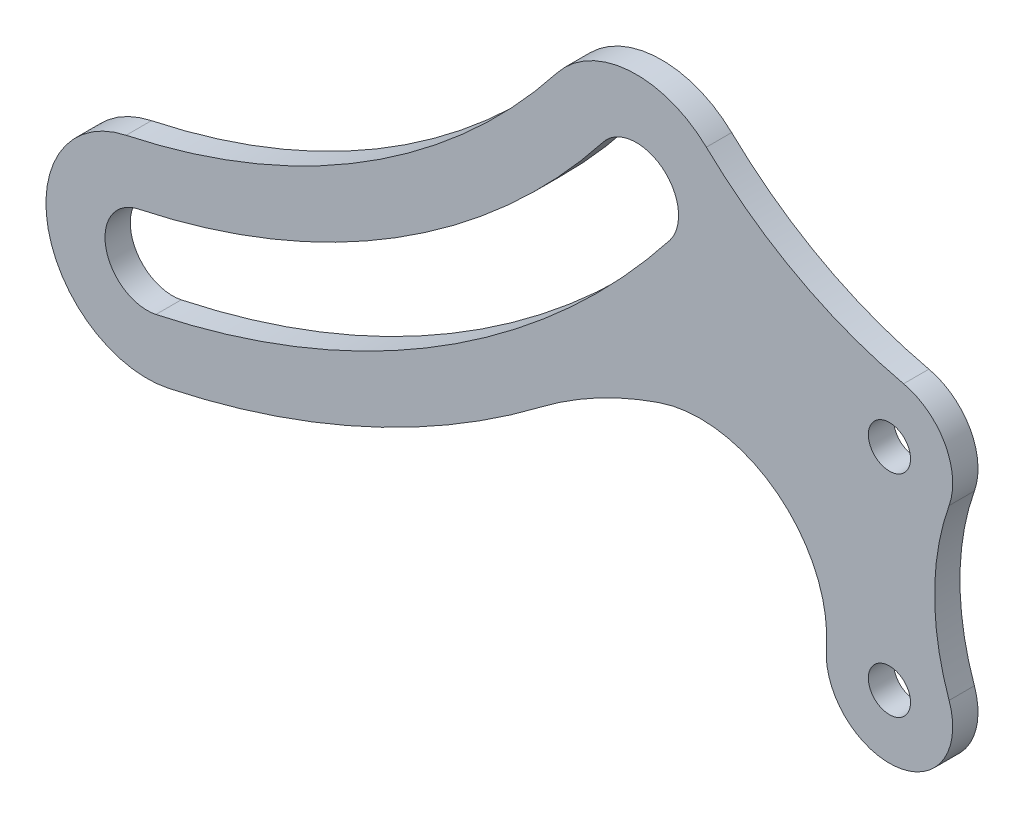
ISO-10303-21;
HEADER;
FILE_DESCRIPTION(('STEP AP214'),'2;1');
FILE_NAME('part.step','',(''),(''),'','','');
FILE_SCHEMA(('AUTOMOTIVE_DESIGN { 1 0 10303 214 1 1 1 1 }'));
ENDSEC;
DATA;
#1=APPLICATION_CONTEXT('core data for automotive mechanical design processes');
#2=APPLICATION_PROTOCOL_DEFINITION('international standard','automotive_design',2000,#1);
#3=PRODUCT_CONTEXT('',#1,'mechanical');
#4=PRODUCT('Part','Part','',(#3));
#5=PRODUCT_RELATED_PRODUCT_CATEGORY('part','',(#4));
#6=PRODUCT_DEFINITION_FORMATION('','',#4);
#7=PRODUCT_DEFINITION_CONTEXT('part definition',#1,'design');
#8=PRODUCT_DEFINITION('design','',#6,#7);
#9=PRODUCT_DEFINITION_SHAPE('','',#8);
#10=(LENGTH_UNIT() NAMED_UNIT(*) SI_UNIT(.MILLI.,.METRE.));
#11=(NAMED_UNIT(*) PLANE_ANGLE_UNIT() SI_UNIT($,.RADIAN.));
#12=(NAMED_UNIT(*) SI_UNIT($,.STERADIAN.) SOLID_ANGLE_UNIT());
#13=UNCERTAINTY_MEASURE_WITH_UNIT(LENGTH_MEASURE(1.E-05),#10,'distance_accuracy_value','');
#14=(GEOMETRIC_REPRESENTATION_CONTEXT(3) GLOBAL_UNCERTAINTY_ASSIGNED_CONTEXT((#13)) GLOBAL_UNIT_ASSIGNED_CONTEXT((#10,
#11,#12)) REPRESENTATION_CONTEXT('',''));
#15=CARTESIAN_POINT('',(0.,0.,0.));
#16=DIRECTION('',(0.,0.,1.));
#17=DIRECTION('',(1.,0.,0.));
#18=AXIS2_PLACEMENT_3D('',#15,#16,#17);
#19=CARTESIAN_POINT('',(-20.791169081776,97.8147600733805,3.));
#20=DIRECTION('',(0.,0.,-1.));
#21=DIRECTION('',(-1.,0.,0.));
#22=AXIS2_PLACEMENT_3D('',#19,#20,#21);
#23=CYLINDRICAL_SURFACE('',#22,112.);
#24=DIRECTION('',(0.,0.,-1.));
#25=VECTOR('',#24,1.);
#26=CARTESIAN_POINT('',(46.7462043238459,8.46878538246567,3.));
#27=LINE('',#26,#25);
#28=CARTESIAN_POINT('',(46.7462043238459,8.46878538246567,3.));
#29=VERTEX_POINT('',#28);
#30=CARTESIAN_POINT('',(46.7462043238459,8.46878538246567,0.));
#31=VERTEX_POINT('',#30);
#32=EDGE_CURVE('E234',#29,#31,#27,.T.);
#33=ORIENTED_EDGE('',*,*,#32,.F.);
#34=CARTESIAN_POINT('',(-20.791169081776,97.8147600733805,3.));
#35=DIRECTION('',(0.,0.,1.));
#36=DIRECTION('',(1.,0.,0.));
#37=AXIS2_PLACEMENT_3D('',#34,#35,#36);
#38=CIRCLE('',#37,112.);
#39=CARTESIAN_POINT('',(2.49494028981315,-11.7377712088057,3.));
#40=VERTEX_POINT('',#39);
#41=EDGE_CURVE('E253',#40,#29,#38,.T.);
#42=ORIENTED_EDGE('',*,*,#41,.F.);
#43=DIRECTION('',(0.,0.,-1.));
#44=VECTOR('',#43,1.);
#45=CARTESIAN_POINT('',(2.49494028981315,-11.7377712088057,3.));
#46=LINE('',#45,#44);
#47=CARTESIAN_POINT('',(2.49494028981315,-11.7377712088057,0.));
#48=VERTEX_POINT('',#47);
#49=EDGE_CURVE('E296',#40,#48,#46,.T.);
#50=ORIENTED_EDGE('',*,*,#49,.T.);
#51=CARTESIAN_POINT('',(-20.791169081776,97.8147600733805,0.));
#52=DIRECTION('',(0.,0.,1.));
#53=DIRECTION('',(1.,0.,0.));
#54=AXIS2_PLACEMENT_3D('',#51,#52,#53);
#55=CIRCLE('',#54,112.);
#56=EDGE_CURVE('E282',#48,#31,#55,.T.);
#57=ORIENTED_EDGE('',*,*,#56,.T.);
#58=EDGE_LOOP('',(#33,#42,#50,#57));
#59=FACE_BOUND('',#58,.T.);
#60=ADVANCED_FACE('F47',(#59),#23,.T.);
#61=CARTESIAN_POINT('',(58.,36.2359351842436,3.));
#62=DIRECTION('',(0.,0.,-1.));
#63=DIRECTION('',(-1.,0.,0.));
#64=AXIS2_PLACEMENT_3D('',#61,#62,#63);
#65=CYLINDRICAL_SURFACE('',#64,12.);
#66=CARTESIAN_POINT('',(58.,36.2359351842436,3.));
#67=DIRECTION('',(0.,0.,1.));
#68=DIRECTION('',(1.,0.,0.));
#69=AXIS2_PLACEMENT_3D('',#66,#67,#68);
#70=CIRCLE('',#69,12.);
#71=CARTESIAN_POINT('',(66.2934202640586,44.9088343721566,3.));
#72=VERTEX_POINT('',#71);
#73=CARTESIAN_POINT('',(48.5450597101868,43.62539417094,3.));
#74=VERTEX_POINT('',#73);
#75=EDGE_CURVE('E256',#72,#74,#70,.T.);
#76=ORIENTED_EDGE('',*,*,#75,.F.);
#77=DIRECTION('',(0.,0.,-1.));
#78=VECTOR('',#77,1.);
#79=CARTESIAN_POINT('',(66.2934202640586,44.9088343721566,3.));
#80=LINE('',#79,#78);
#81=CARTESIAN_POINT('',(66.2934202640586,44.9088343721566,0.));
#82=VERTEX_POINT('',#81);
#83=EDGE_CURVE('E219',#72,#82,#80,.T.);
#84=ORIENTED_EDGE('',*,*,#83,.T.);
#85=CARTESIAN_POINT('',(58.,36.2359351842436,0.));
#86=DIRECTION('',(0.,0.,1.));
#87=DIRECTION('',(1.,0.,0.));
#88=AXIS2_PLACEMENT_3D('',#85,#86,#87);
#89=CIRCLE('',#88,12.);
#90=CARTESIAN_POINT('',(48.5450597101868,43.62539417094,0.));
#91=VERTEX_POINT('',#90);
#92=EDGE_CURVE('E286',#82,#91,#89,.T.);
#93=ORIENTED_EDGE('',*,*,#92,.T.);
#94=DIRECTION('',(0.,0.,-1.));
#95=VECTOR('',#94,1.);
#96=CARTESIAN_POINT('',(48.5450597101868,43.62539417094,3.));
#97=LINE('',#96,#95);
#98=EDGE_CURVE('E11',#74,#91,#97,.T.);
#99=ORIENTED_EDGE('',*,*,#98,.F.);
#100=EDGE_LOOP('',(#76,#84,#93,#99));
#101=FACE_BOUND('',#100,.T.);
#102=ADVANCED_FACE('F346',(#101),#65,.T.);
#103=CARTESIAN_POINT('',(-20.791169081776,97.8147600733805,3.));
#104=DIRECTION('',(0.,0.,-1.));
#105=DIRECTION('',(-1.,0.,0.));
#106=AXIS2_PLACEMENT_3D('',#103,#104,#105);
#107=CYLINDRICAL_SURFACE('',#106,88.);
#108=CARTESIAN_POINT('',(-20.791169081776,97.8147600733805,0.));
#109=DIRECTION('',(0.,0.,1.));
#110=DIRECTION('',(1.,0.,0.));
#111=AXIS2_PLACEMENT_3D('',#108,#109,#110);
#112=CIRCLE('',#111,88.);
#113=CARTESIAN_POINT('',(-2.49494028981309,11.7377712088057,0.));
#114=VERTEX_POINT('',#113);
#115=EDGE_CURVE('E289',#114,#91,#112,.T.);
#116=ORIENTED_EDGE('',*,*,#115,.F.);
#117=DIRECTION('',(0.,0.,-1.));
#118=VECTOR('',#117,1.);
#119=CARTESIAN_POINT('',(-2.49494028981309,11.7377712088057,3.));
#120=LINE('',#119,#118);
#121=CARTESIAN_POINT('',(-2.49494028981309,11.7377712088057,3.));
#122=VERTEX_POINT('',#121);
#123=EDGE_CURVE('E57',#122,#114,#120,.T.);
#124=ORIENTED_EDGE('',*,*,#123,.F.);
#125=CARTESIAN_POINT('',(-20.791169081776,97.8147600733805,3.));
#126=DIRECTION('',(0.,0.,1.));
#127=DIRECTION('',(1.,0.,0.));
#128=AXIS2_PLACEMENT_3D('',#125,#126,#127);
#129=CIRCLE('',#128,88.);
#130=EDGE_CURVE('E259',#122,#74,#129,.T.);
#131=ORIENTED_EDGE('',*,*,#130,.T.);
#132=ORIENTED_EDGE('',*,*,#98,.T.);
#133=EDGE_LOOP('',(#116,#124,#131,#132));
#134=FACE_BOUND('',#133,.T.);
#135=ADVANCED_FACE('F352',(#134),#107,.F.);
#136=CARTESIAN_POINT('',(58.,36.2359351842436,3.));
#137=DIRECTION('',(0.,0.,-1.));
#138=DIRECTION('',(-1.,0.,0.));
#139=AXIS2_PLACEMENT_3D('',#136,#137,#138);
#140=CYLINDRICAL_SURFACE('',#139,5.00000000000001);
#141=CARTESIAN_POINT('',(58.,36.2359351842436,0.));
#142=DIRECTION('',(0.,0.,1.));
#143=DIRECTION('',(1.,0.,0.));
#144=AXIS2_PLACEMENT_3D('',#141,#142,#143);
#145=CIRCLE('',#144,5.00000000000001);
#146=CARTESIAN_POINT('',(61.9395584540888,33.1569939397867,0.));
#147=VERTEX_POINT('',#146);
#148=CARTESIAN_POINT('',(54.0604415459112,39.3148764287004,0.));
#149=VERTEX_POINT('',#148);
#150=EDGE_CURVE('E237',#147,#149,#145,.T.);
#151=ORIENTED_EDGE('',*,*,#150,.F.);
#152=DIRECTION('',(0.,0.,-1.));
#153=VECTOR('',#152,1.);
#154=CARTESIAN_POINT('',(61.9395584540888,33.1569939397867,3.));
#155=LINE('',#154,#153);
#156=CARTESIAN_POINT('',(61.9395584540888,33.1569939397867,3.));
#157=VERTEX_POINT('',#156);
#158=EDGE_CURVE('E51',#157,#147,#155,.T.);
#159=ORIENTED_EDGE('',*,*,#158,.F.);
#160=CARTESIAN_POINT('',(58.,36.2359351842436,3.));
#161=DIRECTION('',(0.,0.,1.));
#162=DIRECTION('',(1.,0.,0.));
#163=AXIS2_PLACEMENT_3D('',#160,#161,#162);
#164=CIRCLE('',#163,5.00000000000001);
#165=CARTESIAN_POINT('',(54.0604415459112,39.3148764287004,3.));
#166=VERTEX_POINT('',#165);
#167=EDGE_CURVE('E238',#157,#166,#164,.T.);
#168=ORIENTED_EDGE('',*,*,#167,.T.);
#169=DIRECTION('',(0.,0.,-1.));
#170=VECTOR('',#169,1.);
#171=CARTESIAN_POINT('',(54.0604415459112,39.3148764287004,3.));
#172=LINE('',#171,#170);
#173=EDGE_CURVE('E267',#166,#149,#172,.T.);
#174=ORIENTED_EDGE('',*,*,#173,.T.);
#175=EDGE_LOOP('',(#151,#159,#168,#174));
#176=FACE_BOUND('',#175,.T.);
#177=ADVANCED_FACE('F49',(#176),#140,.F.);
#178=CARTESIAN_POINT('',(-20.791169081776,97.8147600733805,3.));
#179=DIRECTION('',(0.,0.,-1.));
#180=DIRECTION('',(-1.,0.,0.));
#181=AXIS2_PLACEMENT_3D('',#178,#179,#180);
#182=CYLINDRICAL_SURFACE('',#181,105.);
#183=CARTESIAN_POINT('',(-20.791169081776,97.8147600733805,0.));
#184=DIRECTION('',(0.,0.,1.));
#185=DIRECTION('',(1.,0.,0.));
#186=AXIS2_PLACEMENT_3D('',#183,#184,#185);
#187=CIRCLE('',#186,105.);
#188=CARTESIAN_POINT('',(1.03955845408884,-4.89073800366904,0.));
#189=VERTEX_POINT('',#188);
#190=EDGE_CURVE('E271',#189,#147,#187,.T.);
#191=ORIENTED_EDGE('',*,*,#190,.F.);
#192=DIRECTION('',(0.,0.,-1.));
#193=VECTOR('',#192,1.);
#194=CARTESIAN_POINT('',(1.03955845408884,-4.89073800366904,3.));
#195=LINE('',#194,#193);
#196=CARTESIAN_POINT('',(1.03955845408884,-4.89073800366904,3.));
#197=VERTEX_POINT('',#196);
#198=EDGE_CURVE('E306',#197,#189,#195,.T.);
#199=ORIENTED_EDGE('',*,*,#198,.F.);
#200=CARTESIAN_POINT('',(-20.791169081776,97.8147600733805,3.));
#201=DIRECTION('',(0.,0.,1.));
#202=DIRECTION('',(1.,0.,0.));
#203=AXIS2_PLACEMENT_3D('',#200,#201,#202);
#204=CIRCLE('',#203,105.);
#205=EDGE_CURVE('E242',#197,#157,#204,.T.);
#206=ORIENTED_EDGE('',*,*,#205,.T.);
#207=ORIENTED_EDGE('',*,*,#158,.T.);
#208=EDGE_LOOP('',(#191,#199,#206,#207));
#209=FACE_BOUND('',#208,.T.);
#210=ADVANCED_FACE('F315',(#209),#182,.F.);
#211=CARTESIAN_POINT('',(0.,0.,3.));
#212=DIRECTION('',(0.,0.,-1.));
#213=DIRECTION('',(-1.,0.,0.));
#214=AXIS2_PLACEMENT_3D('',#211,#212,#213);
#215=CYLINDRICAL_SURFACE('',#214,5.);
#216=CARTESIAN_POINT('',(0.,0.,0.));
#217=DIRECTION('',(0.,0.,1.));
#218=DIRECTION('',(1.,0.,0.));
#219=AXIS2_PLACEMENT_3D('',#216,#217,#218);
#220=CIRCLE('',#219,5.);
#221=CARTESIAN_POINT('',(-1.03955845408877,4.89073800366903,0.));
#222=VERTEX_POINT('',#221);
#223=EDGE_CURVE('E275',#189,#222,#220,.F.);
#224=ORIENTED_EDGE('',*,*,#223,.T.);
#225=DIRECTION('',(0.,0.,-1.));
#226=VECTOR('',#225,1.);
#227=CARTESIAN_POINT('',(-1.03955845408877,4.89073800366903,3.));
#228=LINE('',#227,#226);
#229=CARTESIAN_POINT('',(-1.03955845408877,4.89073800366903,3.));
#230=VERTEX_POINT('',#229);
#231=EDGE_CURVE('E303',#230,#222,#228,.T.);
#232=ORIENTED_EDGE('',*,*,#231,.F.);
#233=CARTESIAN_POINT('',(0.,0.,3.));
#234=DIRECTION('',(0.,0.,1.));
#235=DIRECTION('',(1.,0.,0.));
#236=AXIS2_PLACEMENT_3D('',#233,#234,#235);
#237=CIRCLE('',#236,5.);
#238=EDGE_CURVE('E247',#197,#230,#237,.F.);
#239=ORIENTED_EDGE('',*,*,#238,.F.);
#240=ORIENTED_EDGE('',*,*,#198,.T.);
#241=EDGE_LOOP('',(#224,#232,#239,#240));
#242=FACE_BOUND('',#241,.T.);
#243=ADVANCED_FACE('F324',(#242),#215,.F.);
#244=CARTESIAN_POINT('',(-20.791169081776,97.8147600733805,3.));
#245=DIRECTION('',(0.,0.,-1.));
#246=DIRECTION('',(-1.,0.,0.));
#247=AXIS2_PLACEMENT_3D('',#244,#245,#246);
#248=CYLINDRICAL_SURFACE('',#247,95.);
#249=CARTESIAN_POINT('',(-20.791169081776,97.8147600733805,0.));
#250=DIRECTION('',(0.,0.,1.));
#251=DIRECTION('',(1.,0.,0.));
#252=AXIS2_PLACEMENT_3D('',#249,#250,#251);
#253=CIRCLE('',#252,95.);
#254=EDGE_CURVE('E278',#222,#149,#253,.T.);
#255=ORIENTED_EDGE('',*,*,#254,.T.);
#256=ORIENTED_EDGE('',*,*,#173,.F.);
#257=CARTESIAN_POINT('',(-20.791169081776,97.8147600733805,3.));
#258=DIRECTION('',(0.,0.,1.));
#259=DIRECTION('',(1.,0.,0.));
#260=AXIS2_PLACEMENT_3D('',#257,#258,#259);
#261=CIRCLE('',#260,95.);
#262=EDGE_CURVE('E250',#230,#166,#261,.T.);
#263=ORIENTED_EDGE('',*,*,#262,.F.);
#264=ORIENTED_EDGE('',*,*,#231,.T.);
#265=EDGE_LOOP('',(#255,#256,#263,#264));
#266=FACE_BOUND('',#265,.T.);
#267=ADVANCED_FACE('F327',(#266),#248,.T.);
#268=CARTESIAN_POINT('',(0.,0.,3.));
#269=DIRECTION('',(0.,0.,-1.));
#270=DIRECTION('',(-1.,0.,0.));
#271=AXIS2_PLACEMENT_3D('',#268,#269,#270);
#272=CYLINDRICAL_SURFACE('',#271,12.);
#273=CARTESIAN_POINT('',(0.,0.,0.));
#274=DIRECTION('',(0.,0.,1.));
#275=DIRECTION('',(1.,0.,0.));
#276=AXIS2_PLACEMENT_3D('',#273,#274,#275);
#277=CIRCLE('',#276,12.);
#278=EDGE_CURVE('E243',#48,#114,#277,.F.);
#279=ORIENTED_EDGE('',*,*,#278,.F.);
#280=ORIENTED_EDGE('',*,*,#49,.F.);
#281=CARTESIAN_POINT('',(0.,0.,3.));
#282=DIRECTION('',(0.,0.,1.));
#283=DIRECTION('',(1.,0.,0.));
#284=AXIS2_PLACEMENT_3D('',#281,#282,#283);
#285=CIRCLE('',#284,12.);
#286=EDGE_CURVE('E263',#40,#122,#285,.F.);
#287=ORIENTED_EDGE('',*,*,#286,.T.);
#288=ORIENTED_EDGE('',*,*,#123,.T.);
#289=EDGE_LOOP('',(#279,#280,#287,#288));
#290=FACE_BOUND('',#289,.T.);
#291=ADVANCED_FACE('F330',(#290),#272,.T.);
#292=CARTESIAN_POINT('',(0.,0.,3.));
#293=DIRECTION('',(0.,0.,1.));
#294=DIRECTION('',(1.,0.,0.));
#295=AXIS2_PLACEMENT_3D('',#292,#293,#294);
#296=PLANE('',#295);
#297=CARTESIAN_POINT('',(88.,0.,3.));
#298=DIRECTION('',(0.,0.,1.));
#299=DIRECTION('',(1.,0.,0.));
#300=AXIS2_PLACEMENT_3D('',#297,#298,#299);
#301=CIRCLE('',#300,2.49999999999999);
#302=CARTESIAN_POINT('',(90.5,0.,3.));
#303=VERTEX_POINT('',#302);
#304=EDGE_CURVE('E183',#303,#303,#301,.T.);
#305=ORIENTED_EDGE('',*,*,#304,.F.);
#306=EDGE_LOOP('',(#305));
#307=FACE_BOUND('',#306,.T.);
#308=CARTESIAN_POINT('',(76.8968174513557,-31.4178104616927,3.));
#309=DIRECTION('',(0.,0.,1.));
#310=DIRECTION('',(1.,0.,0.));
#311=AXIS2_PLACEMENT_3D('',#308,#309,#310);
#312=CIRCLE('',#311,49.9999999999999);
#313=CARTESIAN_POINT('',(60.7071666336576,15.8885866363848,3.));
#314=VERTEX_POINT('',#313);
#315=EDGE_CURVE('E174',#314,#29,#312,.T.);
#316=ORIENTED_EDGE('',*,*,#315,.F.);
#317=CARTESIAN_POINT('',(65.564061878967,1.69666750696162,3.));
#318=DIRECTION('',(0.,0.,1.));
#319=DIRECTION('',(1.,0.,0.));
#320=AXIS2_PLACEMENT_3D('',#317,#318,#319);
#321=CIRCLE('',#320,15.);
#322=CARTESIAN_POINT('',(80.5213539596557,0.565555835653875,3.));
#323=VERTEX_POINT('',#322);
#324=EDGE_CURVE('E153',#323,#314,#321,.T.);
#325=ORIENTED_EDGE('',*,*,#324,.F.);
#326=CARTESIAN_POINT('',(88.,0.,3.));
#327=DIRECTION('',(0.,0.,1.));
#328=DIRECTION('',(1.,0.,0.));
#329=AXIS2_PLACEMENT_3D('',#326,#327,#328);
#330=CIRCLE('',#329,7.50000000000001);
#331=CARTESIAN_POINT('',(95.0710678118655,2.5,3.));
#332=VERTEX_POINT('',#331);
#333=EDGE_CURVE('E163',#323,#332,#330,.T.);
#334=ORIENTED_EDGE('',*,*,#333,.T.);
#335=CARTESIAN_POINT('',(123.355339059327,12.5,3.));
#336=DIRECTION('',(0.,0.,1.));
#337=DIRECTION('',(1.,0.,0.));
#338=AXIS2_PLACEMENT_3D('',#335,#336,#337);
#339=CIRCLE('',#338,30.);
#340=CARTESIAN_POINT('',(95.0710678118655,22.5,3.));
#341=VERTEX_POINT('',#340);
#342=EDGE_CURVE('E169',#341,#332,#339,.T.);
#343=ORIENTED_EDGE('',*,*,#342,.F.);
#344=CARTESIAN_POINT('',(88.,25.,3.));
#345=DIRECTION('',(0.,0.,1.));
#346=DIRECTION('',(1.,0.,0.));
#347=AXIS2_PLACEMENT_3D('',#344,#345,#346);
#348=CIRCLE('',#347,7.5);
#349=CARTESIAN_POINT('',(89.6760006127352,32.3103366506688,3.));
#350=VERTEX_POINT('',#349);
#351=EDGE_CURVE('E211',#341,#350,#348,.T.);
#352=ORIENTED_EDGE('',*,*,#351,.T.);
#353=CARTESIAN_POINT('',(100.84933803097,81.0459143217941,3.));
#354=DIRECTION('',(0.,0.,1.));
#355=DIRECTION('',(1.,0.,0.));
#356=AXIS2_PLACEMENT_3D('',#353,#354,#355);
#357=CIRCLE('',#356,50.);
#358=EDGE_CURVE('E215',#72,#350,#357,.T.);
#359=ORIENTED_EDGE('',*,*,#358,.F.);
#360=ORIENTED_EDGE('',*,*,#75,.T.);
#361=ORIENTED_EDGE('',*,*,#130,.F.);
#362=ORIENTED_EDGE('',*,*,#286,.F.);
#363=ORIENTED_EDGE('',*,*,#41,.T.);
#364=EDGE_LOOP('',(#316,#325,#334,#343,#352,#359,#360,#361,#362,#363));
#365=FACE_BOUND('',#364,.T.);
#366=CARTESIAN_POINT('',(88.,25.,3.));
#367=DIRECTION('',(0.,0.,1.));
#368=DIRECTION('',(1.,0.,0.));
#369=AXIS2_PLACEMENT_3D('',#366,#367,#368);
#370=CIRCLE('',#369,2.49999999999999);
#371=CARTESIAN_POINT('',(90.5,25.,3.));
#372=VERTEX_POINT('',#371);
#373=EDGE_CURVE('E201',#372,#372,#370,.T.);
#374=ORIENTED_EDGE('',*,*,#373,.F.);
#375=EDGE_LOOP('',(#374));
#376=FACE_BOUND('',#375,.T.);
#377=ORIENTED_EDGE('',*,*,#167,.F.);
#378=ORIENTED_EDGE('',*,*,#205,.F.);
#379=ORIENTED_EDGE('',*,*,#238,.T.);
#380=ORIENTED_EDGE('',*,*,#262,.T.);
#381=EDGE_LOOP('',(#377,#378,#379,#380));
#382=FACE_BOUND('',#381,.T.);
#383=ADVANCED_FACE('F171',(#307,#365,#376,#382),#296,.T.);
#384=CARTESIAN_POINT('',(0.,0.,0.));
#385=DIRECTION('',(0.,0.,1.));
#386=DIRECTION('',(1.,0.,0.));
#387=AXIS2_PLACEMENT_3D('',#384,#385,#386);
#388=PLANE('',#387);
#389=CARTESIAN_POINT('',(88.,0.,0.));
#390=DIRECTION('',(0.,0.,1.));
#391=DIRECTION('',(1.,0.,0.));
#392=AXIS2_PLACEMENT_3D('',#389,#390,#391);
#393=CIRCLE('',#392,2.49999999999999);
#394=CARTESIAN_POINT('',(90.5,0.,0.));
#395=VERTEX_POINT('',#394);
#396=EDGE_CURVE('E191',#395,#395,#393,.T.);
#397=ORIENTED_EDGE('',*,*,#396,.T.);
#398=EDGE_LOOP('',(#397));
#399=FACE_BOUND('',#398,.T.);
#400=CARTESIAN_POINT('',(65.564061878967,1.69666750696162,0.));
#401=DIRECTION('',(0.,0.,1.));
#402=DIRECTION('',(1.,0.,0.));
#403=AXIS2_PLACEMENT_3D('',#400,#401,#402);
#404=CIRCLE('',#403,15.);
#405=CARTESIAN_POINT('',(80.5213539596557,0.565555835653875,0.));
#406=VERTEX_POINT('',#405);
#407=CARTESIAN_POINT('',(60.7071666336576,15.8885866363848,0.));
#408=VERTEX_POINT('',#407);
#409=EDGE_CURVE('E155',#406,#408,#404,.T.);
#410=ORIENTED_EDGE('',*,*,#409,.T.);
#411=CARTESIAN_POINT('',(76.8968174513557,-31.4178104616927,0.));
#412=DIRECTION('',(0.,0.,1.));
#413=DIRECTION('',(1.,0.,0.));
#414=AXIS2_PLACEMENT_3D('',#411,#412,#413);
#415=CIRCLE('',#414,49.9999999999999);
#416=EDGE_CURVE('E70',#408,#31,#415,.T.);
#417=ORIENTED_EDGE('',*,*,#416,.T.);
#418=ORIENTED_EDGE('',*,*,#56,.F.);
#419=ORIENTED_EDGE('',*,*,#278,.T.);
#420=ORIENTED_EDGE('',*,*,#115,.T.);
#421=ORIENTED_EDGE('',*,*,#92,.F.);
#422=CARTESIAN_POINT('',(100.84933803097,81.0459143217941,0.));
#423=DIRECTION('',(0.,0.,1.));
#424=DIRECTION('',(1.,0.,0.));
#425=AXIS2_PLACEMENT_3D('',#422,#423,#424);
#426=CIRCLE('',#425,50.);
#427=CARTESIAN_POINT('',(89.6760006127352,32.3103366506688,0.));
#428=VERTEX_POINT('',#427);
#429=EDGE_CURVE('E212',#82,#428,#426,.T.);
#430=ORIENTED_EDGE('',*,*,#429,.T.);
#431=CARTESIAN_POINT('',(88.,25.,0.));
#432=DIRECTION('',(0.,0.,1.));
#433=DIRECTION('',(1.,0.,0.));
#434=AXIS2_PLACEMENT_3D('',#431,#432,#433);
#435=CIRCLE('',#434,7.5);
#436=CARTESIAN_POINT('',(95.0710678118655,22.5,0.));
#437=VERTEX_POINT('',#436);
#438=EDGE_CURVE('E222',#437,#428,#435,.T.);
#439=ORIENTED_EDGE('',*,*,#438,.F.);
#440=CARTESIAN_POINT('',(123.355339059327,12.5,0.));
#441=DIRECTION('',(0.,0.,1.));
#442=DIRECTION('',(1.,0.,0.));
#443=AXIS2_PLACEMENT_3D('',#440,#441,#442);
#444=CIRCLE('',#443,30.);
#445=CARTESIAN_POINT('',(95.0710678118655,2.5,0.));
#446=VERTEX_POINT('',#445);
#447=EDGE_CURVE('E176',#437,#446,#444,.T.);
#448=ORIENTED_EDGE('',*,*,#447,.T.);
#449=CARTESIAN_POINT('',(88.,0.,0.));
#450=DIRECTION('',(0.,0.,1.));
#451=DIRECTION('',(1.,0.,0.));
#452=AXIS2_PLACEMENT_3D('',#449,#450,#451);
#453=CIRCLE('',#452,7.50000000000001);
#454=EDGE_CURVE('E180',#406,#446,#453,.T.);
#455=ORIENTED_EDGE('',*,*,#454,.F.);
#456=EDGE_LOOP('',(#410,#417,#418,#419,#420,#421,#430,#439,#448,#455));
#457=FACE_BOUND('',#456,.T.);
#458=CARTESIAN_POINT('',(88.,25.,0.));
#459=DIRECTION('',(0.,0.,1.));
#460=DIRECTION('',(1.,0.,0.));
#461=AXIS2_PLACEMENT_3D('',#458,#459,#460);
#462=CIRCLE('',#461,2.49999999999999);
#463=CARTESIAN_POINT('',(90.5,25.,0.));
#464=VERTEX_POINT('',#463);
#465=EDGE_CURVE('E202',#464,#464,#462,.T.);
#466=ORIENTED_EDGE('',*,*,#465,.T.);
#467=EDGE_LOOP('',(#466));
#468=FACE_BOUND('',#467,.T.);
#469=ORIENTED_EDGE('',*,*,#150,.T.);
#470=ORIENTED_EDGE('',*,*,#254,.F.);
#471=ORIENTED_EDGE('',*,*,#223,.F.);
#472=ORIENTED_EDGE('',*,*,#190,.T.);
#473=EDGE_LOOP('',(#469,#470,#471,#472));
#474=FACE_BOUND('',#473,.T.);
#475=ADVANCED_FACE('F322',(#399,#457,#468,#474),#388,.F.);
#476=CARTESIAN_POINT('',(76.8968174513557,-31.4178104616927,3.));
#477=DIRECTION('',(0.,0.,-1.));
#478=DIRECTION('',(-1.,0.,0.));
#479=AXIS2_PLACEMENT_3D('',#476,#477,#478);
#480=CYLINDRICAL_SURFACE('',#479,49.9999999999999);
#481=DIRECTION('',(0.,0.,-1.));
#482=VECTOR('',#481,1.);
#483=CARTESIAN_POINT('',(60.7071666336576,15.8885866363849,3.));
#484=LINE('',#483,#482);
#485=EDGE_CURVE('E65',#314,#408,#484,.T.);
#486=ORIENTED_EDGE('',*,*,#485,.F.);
#487=ORIENTED_EDGE('',*,*,#315,.T.);
#488=ORIENTED_EDGE('',*,*,#32,.T.);
#489=ORIENTED_EDGE('',*,*,#416,.F.);
#490=EDGE_LOOP('',(#486,#487,#488,#489));
#491=FACE_BOUND('',#490,.T.);
#492=ADVANCED_FACE('F337',(#491),#480,.F.);
#493=CARTESIAN_POINT('',(88.,25.,3.));
#494=DIRECTION('',(0.,0.,-1.));
#495=DIRECTION('',(-1.,0.,0.));
#496=AXIS2_PLACEMENT_3D('',#493,#494,#495);
#497=CYLINDRICAL_SURFACE('',#496,7.5);
#498=ORIENTED_EDGE('',*,*,#351,.F.);
#499=DIRECTION('',(0.,0.,-1.));
#500=VECTOR('',#499,1.);
#501=CARTESIAN_POINT('',(95.0710678118655,22.5,3.));
#502=LINE('',#501,#500);
#503=EDGE_CURVE('E188',#341,#437,#502,.T.);
#504=ORIENTED_EDGE('',*,*,#503,.T.);
#505=ORIENTED_EDGE('',*,*,#438,.T.);
#506=DIRECTION('',(0.,0.,-1.));
#507=VECTOR('',#506,1.);
#508=CARTESIAN_POINT('',(89.6760006127352,32.3103366506688,3.));
#509=LINE('',#508,#507);
#510=EDGE_CURVE('E230',#350,#428,#509,.T.);
#511=ORIENTED_EDGE('',*,*,#510,.F.);
#512=EDGE_LOOP('',(#498,#504,#505,#511));
#513=FACE_BOUND('',#512,.T.);
#514=ADVANCED_FACE('F388',(#513),#497,.T.);
#515=CARTESIAN_POINT('',(100.84933803097,81.0459143217941,3.));
#516=DIRECTION('',(0.,0.,-1.));
#517=DIRECTION('',(-1.,0.,0.));
#518=AXIS2_PLACEMENT_3D('',#515,#516,#517);
#519=CYLINDRICAL_SURFACE('',#518,50.);
#520=ORIENTED_EDGE('',*,*,#429,.F.);
#521=ORIENTED_EDGE('',*,*,#83,.F.);
#522=ORIENTED_EDGE('',*,*,#358,.T.);
#523=ORIENTED_EDGE('',*,*,#510,.T.);
#524=EDGE_LOOP('',(#520,#521,#522,#523));
#525=FACE_BOUND('',#524,.T.);
#526=ADVANCED_FACE('F385',(#525),#519,.F.);
#527=CARTESIAN_POINT('',(88.,25.,0.));
#528=DIRECTION('',(0.,0.,1.));
#529=DIRECTION('',(1.,0.,0.));
#530=AXIS2_PLACEMENT_3D('',#527,#528,#529);
#531=CYLINDRICAL_SURFACE('',#530,2.49999999999999);
#532=ORIENTED_EDGE('',*,*,#465,.F.);
#533=EDGE_LOOP('',(#532));
#534=FACE_BOUND('',#533,.T.);
#535=ORIENTED_EDGE('',*,*,#373,.T.);
#536=EDGE_LOOP('',(#535));
#537=FACE_BOUND('',#536,.T.);
#538=ADVANCED_FACE('F405',(#534,#537),#531,.F.);
#539=CARTESIAN_POINT('',(65.564061878967,1.69666750696162,3.));
#540=DIRECTION('',(0.,0.,-1.));
#541=DIRECTION('',(-1.,0.,0.));
#542=AXIS2_PLACEMENT_3D('',#539,#540,#541);
#543=CYLINDRICAL_SURFACE('',#542,15.);
#544=ORIENTED_EDGE('',*,*,#409,.F.);
#545=DIRECTION('',(0.,0.,-1.));
#546=VECTOR('',#545,1.);
#547=CARTESIAN_POINT('',(80.5213539596557,0.565555835653875,3.));
#548=LINE('',#547,#546);
#549=EDGE_CURVE('E149',#323,#406,#548,.T.);
#550=ORIENTED_EDGE('',*,*,#549,.F.);
#551=ORIENTED_EDGE('',*,*,#324,.T.);
#552=ORIENTED_EDGE('',*,*,#485,.T.);
#553=EDGE_LOOP('',(#544,#550,#551,#552));
#554=FACE_BOUND('',#553,.T.);
#555=ADVANCED_FACE('F151',(#554),#543,.F.);
#556=CARTESIAN_POINT('',(88.,0.,3.));
#557=DIRECTION('',(0.,0.,-1.));
#558=DIRECTION('',(-1.,0.,0.));
#559=AXIS2_PLACEMENT_3D('',#556,#557,#558);
#560=CYLINDRICAL_SURFACE('',#559,7.50000000000001);
#561=ORIENTED_EDGE('',*,*,#454,.T.);
#562=DIRECTION('',(0.,0.,-1.));
#563=VECTOR('',#562,1.);
#564=CARTESIAN_POINT('',(95.0710678118655,2.5,3.));
#565=LINE('',#564,#563);
#566=EDGE_CURVE('E160',#332,#446,#565,.T.);
#567=ORIENTED_EDGE('',*,*,#566,.F.);
#568=ORIENTED_EDGE('',*,*,#333,.F.);
#569=ORIENTED_EDGE('',*,*,#549,.T.);
#570=EDGE_LOOP('',(#561,#567,#568,#569));
#571=FACE_BOUND('',#570,.T.);
#572=ADVANCED_FACE('F164',(#571),#560,.T.);
#573=CARTESIAN_POINT('',(123.355339059327,12.5,3.));
#574=DIRECTION('',(0.,0.,-1.));
#575=DIRECTION('',(-1.,0.,0.));
#576=AXIS2_PLACEMENT_3D('',#573,#574,#575);
#577=CYLINDRICAL_SURFACE('',#576,30.);
#578=ORIENTED_EDGE('',*,*,#447,.F.);
#579=ORIENTED_EDGE('',*,*,#503,.F.);
#580=ORIENTED_EDGE('',*,*,#342,.T.);
#581=ORIENTED_EDGE('',*,*,#566,.T.);
#582=EDGE_LOOP('',(#578,#579,#580,#581));
#583=FACE_BOUND('',#582,.T.);
#584=ADVANCED_FACE('F392',(#583),#577,.F.);
#585=CARTESIAN_POINT('',(88.,0.,0.));
#586=DIRECTION('',(0.,0.,1.));
#587=DIRECTION('',(1.,0.,0.));
#588=AXIS2_PLACEMENT_3D('',#585,#586,#587);
#589=CYLINDRICAL_SURFACE('',#588,2.49999999999999);
#590=ORIENTED_EDGE('',*,*,#396,.F.);
#591=EDGE_LOOP('',(#590));
#592=FACE_BOUND('',#591,.T.);
#593=ORIENTED_EDGE('',*,*,#304,.T.);
#594=EDGE_LOOP('',(#593));
#595=FACE_BOUND('',#594,.T.);
#596=ADVANCED_FACE('F393',(#592,#595),#589,.F.);
#597=CLOSED_SHELL('',(#60,#102,#135,#177,#210,#243,#267,#291,#383,#475,#492,#514,#526,#538,#555,
#572,#584,#596));
#598=MANIFOLD_SOLID_BREP('B2',#597);
#599=ADVANCED_BREP_SHAPE_REPRESENTATION('',(#18,#598),#14);
#600=SHAPE_DEFINITION_REPRESENTATION(#9,#599);
ENDSEC;
END-ISO-10303-21;
